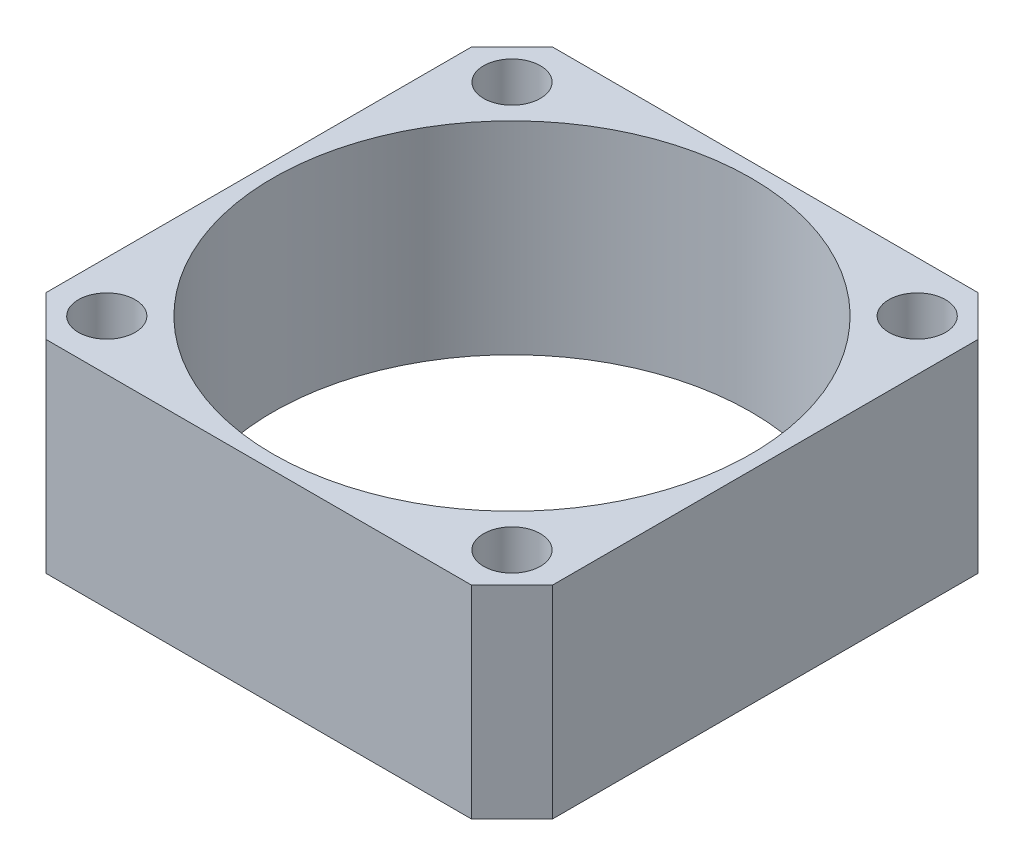
ISO-10303-21;
HEADER;
FILE_DESCRIPTION(('STEP AP214'),'2;1');
FILE_NAME('part.step','',(''),(''),'','','');
FILE_SCHEMA(('AUTOMOTIVE_DESIGN { 1 0 10303 214 1 1 1 1 }'));
ENDSEC;
DATA;
#1=APPLICATION_CONTEXT('core data for automotive mechanical design processes');
#2=APPLICATION_PROTOCOL_DEFINITION('international standard','automotive_design',2000,#1);
#3=PRODUCT_CONTEXT('',#1,'mechanical');
#4=PRODUCT('Part','Part','',(#3));
#5=PRODUCT_RELATED_PRODUCT_CATEGORY('part','',(#4));
#6=PRODUCT_DEFINITION_FORMATION('','',#4);
#7=PRODUCT_DEFINITION_CONTEXT('part definition',#1,'design');
#8=PRODUCT_DEFINITION('design','',#6,#7);
#9=PRODUCT_DEFINITION_SHAPE('','',#8);
#10=(LENGTH_UNIT() NAMED_UNIT(*) SI_UNIT(.MILLI.,.METRE.));
#11=(NAMED_UNIT(*) PLANE_ANGLE_UNIT() SI_UNIT($,.RADIAN.));
#12=(NAMED_UNIT(*) SI_UNIT($,.STERADIAN.) SOLID_ANGLE_UNIT());
#13=UNCERTAINTY_MEASURE_WITH_UNIT(LENGTH_MEASURE(1.E-05),#10,'distance_accuracy_value','');
#14=(GEOMETRIC_REPRESENTATION_CONTEXT(3) GLOBAL_UNCERTAINTY_ASSIGNED_CONTEXT((#13)) GLOBAL_UNIT_ASSIGNED_CONTEXT((#10,
#11,#12)) REPRESENTATION_CONTEXT('',''));
#15=CARTESIAN_POINT('',(0.,0.,0.));
#16=DIRECTION('',(0.,0.,1.));
#17=DIRECTION('',(1.,0.,0.));
#18=AXIS2_PLACEMENT_3D('',#15,#16,#17);
#19=CARTESIAN_POINT('',(-12.5,10.,0.));
#20=DIRECTION('',(-1.,0.,0.));
#21=DIRECTION('',(0.,0.,1.));
#22=AXIS2_PLACEMENT_3D('',#19,#20,#21);
#23=PLANE('',#22);
#24=DIRECTION('',(0.,0.,-1.));
#25=VECTOR('',#24,1.);
#26=CARTESIAN_POINT('',(-12.5,0.,0.));
#27=LINE('',#26,#25);
#28=CARTESIAN_POINT('',(-12.5,0.,10.5));
#29=VERTEX_POINT('',#28);
#30=CARTESIAN_POINT('',(-12.5,0.,-10.5));
#31=VERTEX_POINT('',#30);
#32=EDGE_CURVE('E150',#29,#31,#27,.T.);
#33=ORIENTED_EDGE('',*,*,#32,.F.);
#34=DIRECTION('',(0.,-1.,0.));
#35=VECTOR('',#34,1.);
#36=CARTESIAN_POINT('',(-12.5,10.,10.5));
#37=LINE('',#36,#35);
#38=CARTESIAN_POINT('',(-12.5,10.,10.5));
#39=VERTEX_POINT('',#38);
#40=EDGE_CURVE('E11',#39,#29,#37,.T.);
#41=ORIENTED_EDGE('',*,*,#40,.F.);
#42=DIRECTION('',(0.,0.,-1.));
#43=VECTOR('',#42,1.);
#44=CARTESIAN_POINT('',(-12.5,10.,0.));
#45=LINE('',#44,#43);
#46=CARTESIAN_POINT('',(-12.5,10.,-10.5));
#47=VERTEX_POINT('',#46);
#48=EDGE_CURVE('E372',#39,#47,#45,.T.);
#49=ORIENTED_EDGE('',*,*,#48,.T.);
#50=DIRECTION('',(0.,-1.,0.));
#51=VECTOR('',#50,1.);
#52=CARTESIAN_POINT('',(-12.5,10.,-10.5));
#53=LINE('',#52,#51);
#54=EDGE_CURVE('E58',#47,#31,#53,.T.);
#55=ORIENTED_EDGE('',*,*,#54,.T.);
#56=EDGE_LOOP('',(#33,#41,#49,#55));
#57=FACE_BOUND('',#56,.T.);
#58=ADVANCED_FACE('F41',(#57),#23,.T.);
#59=CARTESIAN_POINT('',(-11.5,10.,11.5));
#60=DIRECTION('',(0.707106781186548,0.,-0.707106781186548));
#61=DIRECTION('',(-0.707106781186548,0.,-0.707106781186548));
#62=AXIS2_PLACEMENT_3D('',#59,#60,#61);
#63=PLANE('',#62);
#64=DIRECTION('',(0.707106781186548,0.,0.707106781186548));
#65=VECTOR('',#64,1.);
#66=CARTESIAN_POINT('',(-11.5,0.,11.5));
#67=LINE('',#66,#65);
#68=CARTESIAN_POINT('',(-10.5,0.,12.5));
#69=VERTEX_POINT('',#68);
#70=EDGE_CURVE('E152',#29,#69,#67,.T.);
#71=ORIENTED_EDGE('',*,*,#70,.T.);
#72=DIRECTION('',(0.,-1.,0.));
#73=VECTOR('',#72,1.);
#74=CARTESIAN_POINT('',(-10.5,10.,12.5));
#75=LINE('',#74,#73);
#76=CARTESIAN_POINT('',(-10.5,10.,12.5));
#77=VERTEX_POINT('',#76);
#78=EDGE_CURVE('E50',#77,#69,#75,.T.);
#79=ORIENTED_EDGE('',*,*,#78,.F.);
#80=DIRECTION('',(0.707106781186548,0.,0.707106781186548));
#81=VECTOR('',#80,1.);
#82=CARTESIAN_POINT('',(-11.5,10.,11.5));
#83=LINE('',#82,#81);
#84=EDGE_CURVE('E368',#39,#77,#83,.T.);
#85=ORIENTED_EDGE('',*,*,#84,.F.);
#86=ORIENTED_EDGE('',*,*,#40,.T.);
#87=EDGE_LOOP('',(#71,#79,#85,#86));
#88=FACE_BOUND('',#87,.T.);
#89=ADVANCED_FACE('F189',(#88),#63,.F.);
#90=CARTESIAN_POINT('',(0.,10.,12.5));
#91=DIRECTION('',(0.,0.,-1.));
#92=DIRECTION('',(-1.,0.,0.));
#93=AXIS2_PLACEMENT_3D('',#90,#91,#92);
#94=PLANE('',#93);
#95=DIRECTION('',(1.,0.,0.));
#96=VECTOR('',#95,1.);
#97=CARTESIAN_POINT('',(0.,0.,12.5));
#98=LINE('',#97,#96);
#99=CARTESIAN_POINT('',(10.5,0.,12.5));
#100=VERTEX_POINT('',#99);
#101=EDGE_CURVE('E155',#69,#100,#98,.T.);
#102=ORIENTED_EDGE('',*,*,#101,.T.);
#103=DIRECTION('',(0.,-1.,0.));
#104=VECTOR('',#103,1.);
#105=CARTESIAN_POINT('',(10.5,10.,12.5));
#106=LINE('',#105,#104);
#107=CARTESIAN_POINT('',(10.5,10.,12.5));
#108=VERTEX_POINT('',#107);
#109=EDGE_CURVE('E177',#108,#100,#106,.T.);
#110=ORIENTED_EDGE('',*,*,#109,.F.);
#111=DIRECTION('',(1.,0.,0.));
#112=VECTOR('',#111,1.);
#113=CARTESIAN_POINT('',(0.,10.,12.5));
#114=LINE('',#113,#112);
#115=EDGE_CURVE('E185',#77,#108,#114,.T.);
#116=ORIENTED_EDGE('',*,*,#115,.F.);
#117=ORIENTED_EDGE('',*,*,#78,.T.);
#118=EDGE_LOOP('',(#102,#110,#116,#117));
#119=FACE_BOUND('',#118,.T.);
#120=ADVANCED_FACE('F182',(#119),#94,.F.);
#121=CARTESIAN_POINT('',(11.5,10.,11.5));
#122=DIRECTION('',(-0.707106781186548,0.,-0.707106781186548));
#123=DIRECTION('',(-0.707106781186548,0.,0.707106781186548));
#124=AXIS2_PLACEMENT_3D('',#121,#122,#123);
#125=PLANE('',#124);
#126=DIRECTION('',(0.707106781186548,0.,-0.707106781186548));
#127=VECTOR('',#126,1.);
#128=CARTESIAN_POINT('',(11.5,0.,11.5));
#129=LINE('',#128,#127);
#130=CARTESIAN_POINT('',(12.5,0.,10.5));
#131=VERTEX_POINT('',#130);
#132=EDGE_CURVE('E158',#100,#131,#129,.T.);
#133=ORIENTED_EDGE('',*,*,#132,.T.);
#134=DIRECTION('',(0.,-1.,0.));
#135=VECTOR('',#134,1.);
#136=CARTESIAN_POINT('',(12.5,10.,10.5));
#137=LINE('',#136,#135);
#138=CARTESIAN_POINT('',(12.5,10.,10.5));
#139=VERTEX_POINT('',#138);
#140=EDGE_CURVE('E174',#139,#131,#137,.T.);
#141=ORIENTED_EDGE('',*,*,#140,.F.);
#142=DIRECTION('',(0.707106781186548,0.,-0.707106781186548));
#143=VECTOR('',#142,1.);
#144=CARTESIAN_POINT('',(11.5,10.,11.5));
#145=LINE('',#144,#143);
#146=EDGE_CURVE('E366',#108,#139,#145,.T.);
#147=ORIENTED_EDGE('',*,*,#146,.F.);
#148=ORIENTED_EDGE('',*,*,#109,.T.);
#149=EDGE_LOOP('',(#133,#141,#147,#148));
#150=FACE_BOUND('',#149,.T.);
#151=ADVANCED_FACE('F252',(#150),#125,.F.);
#152=CARTESIAN_POINT('',(12.5,10.,0.));
#153=DIRECTION('',(-1.,0.,0.));
#154=DIRECTION('',(0.,0.,1.));
#155=AXIS2_PLACEMENT_3D('',#152,#153,#154);
#156=PLANE('',#155);
#157=DIRECTION('',(0.,0.,-1.));
#158=VECTOR('',#157,1.);
#159=CARTESIAN_POINT('',(12.5,0.,0.));
#160=LINE('',#159,#158);
#161=CARTESIAN_POINT('',(12.5,0.,-10.5));
#162=VERTEX_POINT('',#161);
#163=EDGE_CURVE('E161',#131,#162,#160,.T.);
#164=ORIENTED_EDGE('',*,*,#163,.T.);
#165=DIRECTION('',(0.,-1.,0.));
#166=VECTOR('',#165,1.);
#167=CARTESIAN_POINT('',(12.5,10.,-10.5));
#168=LINE('',#167,#166);
#169=CARTESIAN_POINT('',(12.5,10.,-10.5));
#170=VERTEX_POINT('',#169);
#171=EDGE_CURVE('E117',#170,#162,#168,.T.);
#172=ORIENTED_EDGE('',*,*,#171,.F.);
#173=DIRECTION('',(0.,0.,-1.));
#174=VECTOR('',#173,1.);
#175=CARTESIAN_POINT('',(12.5,10.,0.));
#176=LINE('',#175,#174);
#177=EDGE_CURVE('E126',#139,#170,#176,.T.);
#178=ORIENTED_EDGE('',*,*,#177,.F.);
#179=ORIENTED_EDGE('',*,*,#140,.T.);
#180=EDGE_LOOP('',(#164,#172,#178,#179));
#181=FACE_BOUND('',#180,.T.);
#182=ADVANCED_FACE('F249',(#181),#156,.F.);
#183=CARTESIAN_POINT('',(11.5,10.,-11.5));
#184=DIRECTION('',(0.707106781186548,0.,-0.707106781186548));
#185=DIRECTION('',(-0.707106781186548,0.,-0.707106781186548));
#186=AXIS2_PLACEMENT_3D('',#183,#184,#185);
#187=PLANE('',#186);
#188=DIRECTION('',(0.707106781186548,0.,0.707106781186548));
#189=VECTOR('',#188,1.);
#190=CARTESIAN_POINT('',(11.5,0.,-11.5));
#191=LINE('',#190,#189);
#192=CARTESIAN_POINT('',(10.5,0.,-12.5));
#193=VERTEX_POINT('',#192);
#194=EDGE_CURVE('E113',#193,#162,#191,.T.);
#195=ORIENTED_EDGE('',*,*,#194,.F.);
#196=DIRECTION('',(0.,-1.,0.));
#197=VECTOR('',#196,1.);
#198=CARTESIAN_POINT('',(10.5,10.,-12.5));
#199=LINE('',#198,#197);
#200=CARTESIAN_POINT('',(10.5,10.,-12.5));
#201=VERTEX_POINT('',#200);
#202=EDGE_CURVE('E108',#201,#193,#199,.T.);
#203=ORIENTED_EDGE('',*,*,#202,.F.);
#204=DIRECTION('',(0.707106781186548,0.,0.707106781186548));
#205=VECTOR('',#204,1.);
#206=CARTESIAN_POINT('',(11.5,10.,-11.5));
#207=LINE('',#206,#205);
#208=EDGE_CURVE('E111',#201,#170,#207,.T.);
#209=ORIENTED_EDGE('',*,*,#208,.T.);
#210=ORIENTED_EDGE('',*,*,#171,.T.);
#211=EDGE_LOOP('',(#195,#203,#209,#210));
#212=FACE_BOUND('',#211,.T.);
#213=ADVANCED_FACE('F110',(#212),#187,.T.);
#214=CARTESIAN_POINT('',(0.,10.,-12.5));
#215=DIRECTION('',(0.,0.,-1.));
#216=DIRECTION('',(-1.,0.,0.));
#217=AXIS2_PLACEMENT_3D('',#214,#215,#216);
#218=PLANE('',#217);
#219=DIRECTION('',(1.,0.,0.));
#220=VECTOR('',#219,1.);
#221=CARTESIAN_POINT('',(0.,0.,-12.5));
#222=LINE('',#221,#220);
#223=CARTESIAN_POINT('',(-10.5,0.,-12.5));
#224=VERTEX_POINT('',#223);
#225=EDGE_CURVE('E165',#224,#193,#222,.T.);
#226=ORIENTED_EDGE('',*,*,#225,.F.);
#227=DIRECTION('',(0.,-1.,0.));
#228=VECTOR('',#227,1.);
#229=CARTESIAN_POINT('',(-10.5,10.,-12.5));
#230=LINE('',#229,#228);
#231=CARTESIAN_POINT('',(-10.5,10.,-12.5));
#232=VERTEX_POINT('',#231);
#233=EDGE_CURVE('E83',#232,#224,#230,.T.);
#234=ORIENTED_EDGE('',*,*,#233,.F.);
#235=DIRECTION('',(1.,0.,0.));
#236=VECTOR('',#235,1.);
#237=CARTESIAN_POINT('',(0.,10.,-12.5));
#238=LINE('',#237,#236);
#239=EDGE_CURVE('E124',#232,#201,#238,.T.);
#240=ORIENTED_EDGE('',*,*,#239,.T.);
#241=ORIENTED_EDGE('',*,*,#202,.T.);
#242=EDGE_LOOP('',(#226,#234,#240,#241));
#243=FACE_BOUND('',#242,.T.);
#244=ADVANCED_FACE('F129',(#243),#218,.T.);
#245=CARTESIAN_POINT('',(10.,10.,10.));
#246=DIRECTION('',(0.,-1.,0.));
#247=DIRECTION('',(0.,0.,-1.));
#248=AXIS2_PLACEMENT_3D('',#245,#246,#247);
#249=CYLINDRICAL_SURFACE('',#248,1.4);
#250=CARTESIAN_POINT('',(10.,10.,10.));
#251=DIRECTION('',(0.,1.,0.));
#252=DIRECTION('',(0.,0.,1.));
#253=AXIS2_PLACEMENT_3D('',#250,#251,#252);
#254=CIRCLE('',#253,1.4);
#255=CARTESIAN_POINT('',(10.,10.,11.4));
#256=VERTEX_POINT('',#255);
#257=EDGE_CURVE('E374',#256,#256,#254,.T.);
#258=ORIENTED_EDGE('',*,*,#257,.T.);
#259=EDGE_LOOP('',(#258));
#260=FACE_BOUND('',#259,.T.);
#261=CARTESIAN_POINT('',(10.,0.,10.));
#262=DIRECTION('',(0.,1.,0.));
#263=DIRECTION('',(0.,0.,1.));
#264=AXIS2_PLACEMENT_3D('',#261,#262,#263);
#265=CIRCLE('',#264,1.4);
#266=CARTESIAN_POINT('',(10.,0.,11.4));
#267=VERTEX_POINT('',#266);
#268=EDGE_CURVE('E147',#267,#267,#265,.T.);
#269=ORIENTED_EDGE('',*,*,#268,.F.);
#270=EDGE_LOOP('',(#269));
#271=FACE_BOUND('',#270,.T.);
#272=ADVANCED_FACE('F200',(#260,#271),#249,.F.);
#273=CARTESIAN_POINT('',(-10.,10.,10.));
#274=DIRECTION('',(0.,-1.,0.));
#275=DIRECTION('',(0.,0.,-1.));
#276=AXIS2_PLACEMENT_3D('',#273,#274,#275);
#277=CYLINDRICAL_SURFACE('',#276,1.4);
#278=CARTESIAN_POINT('',(-10.,10.,10.));
#279=DIRECTION('',(0.,1.,0.));
#280=DIRECTION('',(0.,0.,1.));
#281=AXIS2_PLACEMENT_3D('',#278,#279,#280);
#282=CIRCLE('',#281,1.4);
#283=CARTESIAN_POINT('',(-10.,10.,11.4));
#284=VERTEX_POINT('',#283);
#285=EDGE_CURVE('E377',#284,#284,#282,.T.);
#286=ORIENTED_EDGE('',*,*,#285,.T.);
#287=EDGE_LOOP('',(#286));
#288=FACE_BOUND('',#287,.T.);
#289=CARTESIAN_POINT('',(-10.,0.,10.));
#290=DIRECTION('',(0.,1.,0.));
#291=DIRECTION('',(0.,0.,1.));
#292=AXIS2_PLACEMENT_3D('',#289,#290,#291);
#293=CIRCLE('',#292,1.4);
#294=CARTESIAN_POINT('',(-10.,0.,11.4));
#295=VERTEX_POINT('',#294);
#296=EDGE_CURVE('E144',#295,#295,#293,.T.);
#297=ORIENTED_EDGE('',*,*,#296,.F.);
#298=EDGE_LOOP('',(#297));
#299=FACE_BOUND('',#298,.T.);
#300=ADVANCED_FACE('F203',(#288,#299),#277,.F.);
#301=CARTESIAN_POINT('',(10.,10.,-10.));
#302=DIRECTION('',(0.,-1.,0.));
#303=DIRECTION('',(0.,0.,-1.));
#304=AXIS2_PLACEMENT_3D('',#301,#302,#303);
#305=CYLINDRICAL_SURFACE('',#304,1.4);
#306=CARTESIAN_POINT('',(10.,10.,-10.));
#307=DIRECTION('',(0.,1.,0.));
#308=DIRECTION('',(0.,0.,1.));
#309=AXIS2_PLACEMENT_3D('',#306,#307,#308);
#310=CIRCLE('',#309,1.4);
#311=CARTESIAN_POINT('',(10.,10.,-8.6));
#312=VERTEX_POINT('',#311);
#313=EDGE_CURVE('E380',#312,#312,#310,.T.);
#314=ORIENTED_EDGE('',*,*,#313,.T.);
#315=EDGE_LOOP('',(#314));
#316=FACE_BOUND('',#315,.T.);
#317=CARTESIAN_POINT('',(10.,0.,-10.));
#318=DIRECTION('',(0.,1.,0.));
#319=DIRECTION('',(0.,0.,1.));
#320=AXIS2_PLACEMENT_3D('',#317,#318,#319);
#321=CIRCLE('',#320,1.4);
#322=CARTESIAN_POINT('',(10.,0.,-8.6));
#323=VERTEX_POINT('',#322);
#324=EDGE_CURVE('E141',#323,#323,#321,.T.);
#325=ORIENTED_EDGE('',*,*,#324,.F.);
#326=EDGE_LOOP('',(#325));
#327=FACE_BOUND('',#326,.T.);
#328=ADVANCED_FACE('F207',(#316,#327),#305,.F.);
#329=CARTESIAN_POINT('',(-10.,10.,-10.));
#330=DIRECTION('',(0.,-1.,0.));
#331=DIRECTION('',(0.,0.,-1.));
#332=AXIS2_PLACEMENT_3D('',#329,#330,#331);
#333=CYLINDRICAL_SURFACE('',#332,1.4);
#334=CARTESIAN_POINT('',(-10.,10.,-10.));
#335=DIRECTION('',(0.,1.,0.));
#336=DIRECTION('',(0.,0.,1.));
#337=AXIS2_PLACEMENT_3D('',#334,#335,#336);
#338=CIRCLE('',#337,1.4);
#339=CARTESIAN_POINT('',(-10.,10.,-8.6));
#340=VERTEX_POINT('',#339);
#341=EDGE_CURVE('E222',#340,#340,#338,.T.);
#342=ORIENTED_EDGE('',*,*,#341,.T.);
#343=EDGE_LOOP('',(#342));
#344=FACE_BOUND('',#343,.T.);
#345=CARTESIAN_POINT('',(-10.,0.,-10.));
#346=DIRECTION('',(0.,1.,0.));
#347=DIRECTION('',(0.,0.,1.));
#348=AXIS2_PLACEMENT_3D('',#345,#346,#347);
#349=CIRCLE('',#348,1.4);
#350=CARTESIAN_POINT('',(-10.,0.,-8.6));
#351=VERTEX_POINT('',#350);
#352=EDGE_CURVE('E138',#351,#351,#349,.T.);
#353=ORIENTED_EDGE('',*,*,#352,.F.);
#354=EDGE_LOOP('',(#353));
#355=FACE_BOUND('',#354,.T.);
#356=ADVANCED_FACE('F210',(#344,#355),#333,.F.);
#357=CARTESIAN_POINT('',(0.,10.,0.));
#358=DIRECTION('',(0.,-1.,0.));
#359=DIRECTION('',(0.,0.,-1.));
#360=AXIS2_PLACEMENT_3D('',#357,#358,#359);
#361=CYLINDRICAL_SURFACE('',#360,11.8);
#362=CARTESIAN_POINT('',(0.,10.,0.));
#363=DIRECTION('',(0.,1.,0.));
#364=DIRECTION('',(0.,0.,1.));
#365=AXIS2_PLACEMENT_3D('',#362,#363,#364);
#366=CIRCLE('',#365,11.8);
#367=CARTESIAN_POINT('',(0.,10.,11.8));
#368=VERTEX_POINT('',#367);
#369=EDGE_CURVE('E170',#368,#368,#366,.T.);
#370=ORIENTED_EDGE('',*,*,#369,.T.);
#371=EDGE_LOOP('',(#370));
#372=FACE_BOUND('',#371,.T.);
#373=CARTESIAN_POINT('',(0.,0.,0.));
#374=DIRECTION('',(0.,1.,0.));
#375=DIRECTION('',(0.,0.,1.));
#376=AXIS2_PLACEMENT_3D('',#373,#374,#375);
#377=CIRCLE('',#376,11.8);
#378=CARTESIAN_POINT('',(0.,0.,11.8));
#379=VERTEX_POINT('',#378);
#380=EDGE_CURVE('E135',#379,#379,#377,.T.);
#381=ORIENTED_EDGE('',*,*,#380,.F.);
#382=EDGE_LOOP('',(#381));
#383=FACE_BOUND('',#382,.T.);
#384=ADVANCED_FACE('F43',(#372,#383),#361,.F.);
#385=CARTESIAN_POINT('',(-11.5,10.,-11.5));
#386=DIRECTION('',(-0.707106781186548,0.,-0.707106781186548));
#387=DIRECTION('',(-0.707106781186548,0.,0.707106781186548));
#388=AXIS2_PLACEMENT_3D('',#385,#386,#387);
#389=PLANE('',#388);
#390=DIRECTION('',(0.707106781186548,0.,-0.707106781186548));
#391=VECTOR('',#390,1.);
#392=CARTESIAN_POINT('',(-11.5,0.,-11.5));
#393=LINE('',#392,#391);
#394=EDGE_CURVE('E167',#31,#224,#393,.T.);
#395=ORIENTED_EDGE('',*,*,#394,.F.);
#396=ORIENTED_EDGE('',*,*,#54,.F.);
#397=DIRECTION('',(0.707106781186548,0.,-0.707106781186548));
#398=VECTOR('',#397,1.);
#399=CARTESIAN_POINT('',(-11.5,10.,-11.5));
#400=LINE('',#399,#398);
#401=EDGE_CURVE('E130',#47,#232,#400,.T.);
#402=ORIENTED_EDGE('',*,*,#401,.T.);
#403=ORIENTED_EDGE('',*,*,#233,.T.);
#404=EDGE_LOOP('',(#395,#396,#402,#403));
#405=FACE_BOUND('',#404,.T.);
#406=ADVANCED_FACE('F217',(#405),#389,.T.);
#407=CARTESIAN_POINT('',(0.,10.,0.));
#408=DIRECTION('',(0.,1.,0.));
#409=DIRECTION('',(0.,0.,1.));
#410=AXIS2_PLACEMENT_3D('',#407,#408,#409);
#411=PLANE('',#410);
#412=ORIENTED_EDGE('',*,*,#369,.F.);
#413=EDGE_LOOP('',(#412));
#414=FACE_BOUND('',#413,.T.);
#415=ORIENTED_EDGE('',*,*,#341,.F.);
#416=EDGE_LOOP('',(#415));
#417=FACE_BOUND('',#416,.T.);
#418=ORIENTED_EDGE('',*,*,#313,.F.);
#419=EDGE_LOOP('',(#418));
#420=FACE_BOUND('',#419,.T.);
#421=ORIENTED_EDGE('',*,*,#285,.F.);
#422=EDGE_LOOP('',(#421));
#423=FACE_BOUND('',#422,.T.);
#424=ORIENTED_EDGE('',*,*,#257,.F.);
#425=EDGE_LOOP('',(#424));
#426=FACE_BOUND('',#425,.T.);
#427=ORIENTED_EDGE('',*,*,#48,.F.);
#428=ORIENTED_EDGE('',*,*,#84,.T.);
#429=ORIENTED_EDGE('',*,*,#115,.T.);
#430=ORIENTED_EDGE('',*,*,#146,.T.);
#431=ORIENTED_EDGE('',*,*,#177,.T.);
#432=ORIENTED_EDGE('',*,*,#208,.F.);
#433=ORIENTED_EDGE('',*,*,#239,.F.);
#434=ORIENTED_EDGE('',*,*,#401,.F.);
#435=EDGE_LOOP('',(#427,#428,#429,#430,#431,#432,#433,#434));
#436=FACE_BOUND('',#435,.T.);
#437=ADVANCED_FACE('F122',(#414,#417,#420,#423,#426,#436),#411,.T.);
#438=CARTESIAN_POINT('',(0.,0.,0.));
#439=DIRECTION('',(0.,1.,0.));
#440=DIRECTION('',(0.,0.,1.));
#441=AXIS2_PLACEMENT_3D('',#438,#439,#440);
#442=PLANE('',#441);
#443=ORIENTED_EDGE('',*,*,#380,.T.);
#444=EDGE_LOOP('',(#443));
#445=FACE_BOUND('',#444,.T.);
#446=ORIENTED_EDGE('',*,*,#352,.T.);
#447=EDGE_LOOP('',(#446));
#448=FACE_BOUND('',#447,.T.);
#449=ORIENTED_EDGE('',*,*,#324,.T.);
#450=EDGE_LOOP('',(#449));
#451=FACE_BOUND('',#450,.T.);
#452=ORIENTED_EDGE('',*,*,#296,.T.);
#453=EDGE_LOOP('',(#452));
#454=FACE_BOUND('',#453,.T.);
#455=ORIENTED_EDGE('',*,*,#268,.T.);
#456=EDGE_LOOP('',(#455));
#457=FACE_BOUND('',#456,.T.);
#458=ORIENTED_EDGE('',*,*,#32,.T.);
#459=ORIENTED_EDGE('',*,*,#394,.T.);
#460=ORIENTED_EDGE('',*,*,#225,.T.);
#461=ORIENTED_EDGE('',*,*,#194,.T.);
#462=ORIENTED_EDGE('',*,*,#163,.F.);
#463=ORIENTED_EDGE('',*,*,#132,.F.);
#464=ORIENTED_EDGE('',*,*,#101,.F.);
#465=ORIENTED_EDGE('',*,*,#70,.F.);
#466=EDGE_LOOP('',(#458,#459,#460,#461,#462,#463,#464,#465));
#467=FACE_BOUND('',#466,.T.);
#468=ADVANCED_FACE('F191',(#445,#448,#451,#454,#457,#467),#442,.F.);
#469=CLOSED_SHELL('',(#58,#89,#120,#151,#182,#213,#244,#272,#300,#328,#356,#384,#406,#437,#468));
#470=MANIFOLD_SOLID_BREP('B2',#469);
#471=ADVANCED_BREP_SHAPE_REPRESENTATION('',(#18,#470),#14);
#472=SHAPE_DEFINITION_REPRESENTATION(#9,#471);
ENDSEC;
END-ISO-10303-21;
